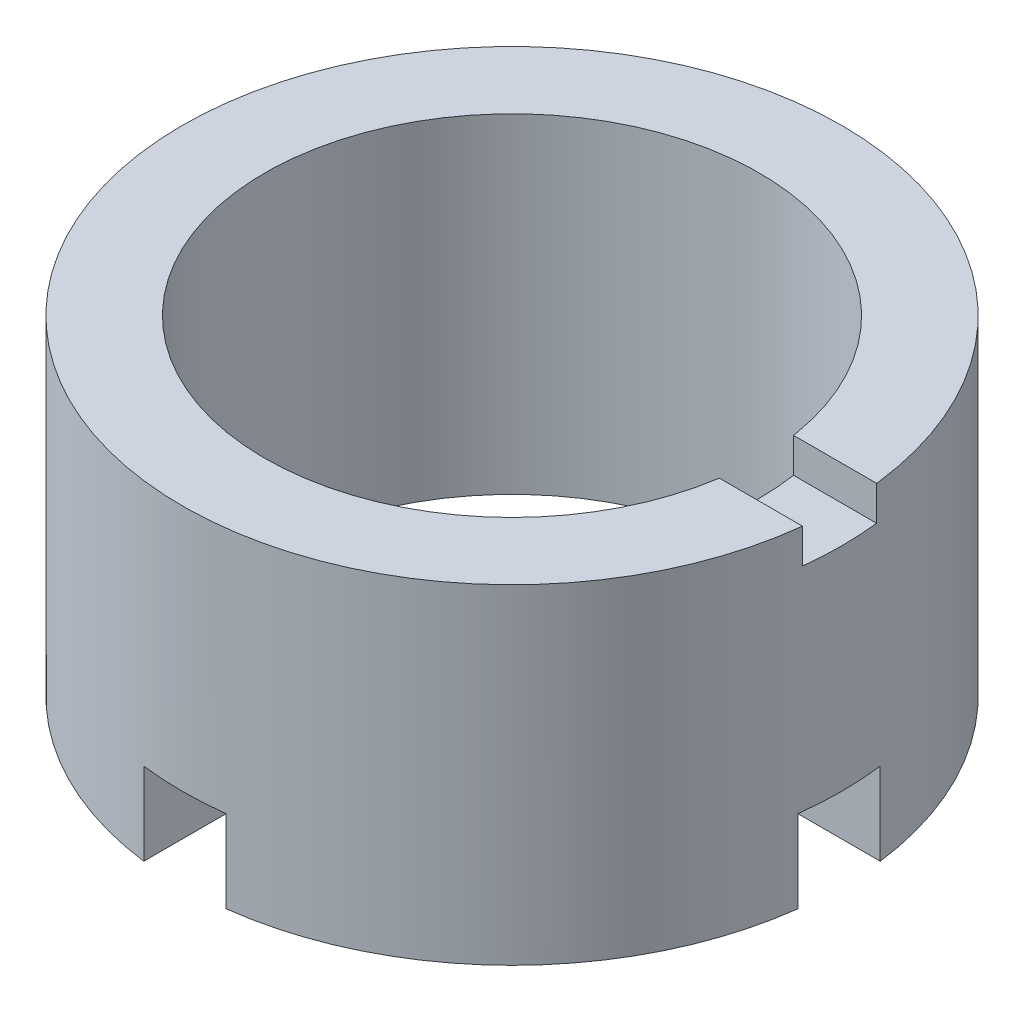
ISO-10303-21;
HEADER;
FILE_DESCRIPTION(('STEP AP214'),'2;1');
FILE_NAME('part.step','',(''),(''),'','','');
FILE_SCHEMA(('AUTOMOTIVE_DESIGN { 1 0 10303 214 1 1 1 1 }'));
ENDSEC;
DATA;
#1=APPLICATION_CONTEXT('core data for automotive mechanical design processes');
#2=APPLICATION_PROTOCOL_DEFINITION('international standard','automotive_design',2000,#1);
#3=PRODUCT_CONTEXT('',#1,'mechanical');
#4=PRODUCT('Part','Part','',(#3));
#5=PRODUCT_RELATED_PRODUCT_CATEGORY('part','',(#4));
#6=PRODUCT_DEFINITION_FORMATION('','',#4);
#7=PRODUCT_DEFINITION_CONTEXT('part definition',#1,'design');
#8=PRODUCT_DEFINITION('design','',#6,#7);
#9=PRODUCT_DEFINITION_SHAPE('','',#8);
#10=(LENGTH_UNIT() NAMED_UNIT(*) SI_UNIT(.MILLI.,.METRE.));
#11=(NAMED_UNIT(*) PLANE_ANGLE_UNIT() SI_UNIT($,.RADIAN.));
#12=(NAMED_UNIT(*) SI_UNIT($,.STERADIAN.) SOLID_ANGLE_UNIT());
#13=UNCERTAINTY_MEASURE_WITH_UNIT(LENGTH_MEASURE(1.E-05),#10,'distance_accuracy_value','');
#14=(GEOMETRIC_REPRESENTATION_CONTEXT(3) GLOBAL_UNCERTAINTY_ASSIGNED_CONTEXT((#13)) GLOBAL_UNIT_ASSIGNED_CONTEXT((#10,
#11,#12)) REPRESENTATION_CONTEXT('',''));
#15=CARTESIAN_POINT('',(0.,0.,0.));
#16=DIRECTION('',(0.,0.,1.));
#17=DIRECTION('',(1.,0.,0.));
#18=AXIS2_PLACEMENT_3D('',#15,#16,#17);
#19=CARTESIAN_POINT('',(0.,0.,0.));
#20=DIRECTION('',(0.,1.,0.));
#21=DIRECTION('',(0.,0.,1.));
#22=AXIS2_PLACEMENT_3D('',#19,#20,#21);
#23=PLANE('',#22);
#24=CARTESIAN_POINT('',(0.,0.,0.));
#25=DIRECTION('',(0.,1.,0.));
#26=DIRECTION('',(0.,0.,1.));
#27=AXIS2_PLACEMENT_3D('',#24,#25,#26);
#28=CIRCLE('',#27,25.4);
#29=CARTESIAN_POINT('',(25.20078123789,0.,-3.17500000000161));
#30=VERTEX_POINT('',#29);
#31=CARTESIAN_POINT('',(-3.17499999999999,0.,25.2007812378902));
#32=VERTEX_POINT('',#31);
#33=EDGE_CURVE('E150',#30,#32,#28,.T.);
#34=ORIENTED_EDGE('',*,*,#33,.F.);
#35=DIRECTION('',(1.,0.,-1.48345037405956E-13));
#36=VECTOR('',#35,1.);
#37=CARTESIAN_POINT('',(33.0200000000024,0.,-3.17500000000277));
#38=LINE('',#37,#36);
#39=CARTESIAN_POINT('',(18.7835533113412,0.,-3.17500000000065));
#40=VERTEX_POINT('',#39);
#41=EDGE_CURVE('E185',#40,#30,#38,.T.);
#42=ORIENTED_EDGE('',*,*,#41,.F.);
#43=CARTESIAN_POINT('',(0.,0.,0.));
#44=DIRECTION('',(0.,1.,0.));
#45=DIRECTION('',(0.,0.,1.));
#46=AXIS2_PLACEMENT_3D('',#43,#44,#45);
#47=CIRCLE('',#46,19.05);
#48=CARTESIAN_POINT('',(-3.17499999999999,0.,18.7835533113413));
#49=VERTEX_POINT('',#48);
#50=EDGE_CURVE('E218',#40,#49,#47,.T.);
#51=ORIENTED_EDGE('',*,*,#50,.T.);
#52=DIRECTION('',(0.,0.,-1.));
#53=VECTOR('',#52,1.);
#54=CARTESIAN_POINT('',(-3.17499999999999,0.,33.02));
#55=LINE('',#54,#53);
#56=EDGE_CURVE('E206',#32,#49,#55,.T.);
#57=ORIENTED_EDGE('',*,*,#56,.F.);
#58=EDGE_LOOP('',(#34,#42,#51,#57));
#59=FACE_BOUND('',#58,.T.);
#60=ADVANCED_FACE('F33',(#59),#23,.F.);
#61=CARTESIAN_POINT('',(0.,25.4,0.));
#62=DIRECTION('',(0.,1.,0.));
#63=DIRECTION('',(0.,0.,1.));
#64=AXIS2_PLACEMENT_3D('',#61,#62,#63);
#65=PLANE('',#64);
#66=DIRECTION('',(1.,0.,0.));
#67=VECTOR('',#66,1.);
#68=CARTESIAN_POINT('',(15.4971331253971,25.4,2.8575));
#69=LINE('',#68,#67);
#70=CARTESIAN_POINT('',(18.8344682364541,25.4,2.8575));
#71=VERTEX_POINT('',#70);
#72=CARTESIAN_POINT('',(25.2387538073891,25.4,2.8575));
#73=VERTEX_POINT('',#72);
#74=EDGE_CURVE('E139',#71,#73,#69,.T.);
#75=ORIENTED_EDGE('',*,*,#74,.F.);
#76=CARTESIAN_POINT('',(0.,25.4,0.));
#77=DIRECTION('',(0.,1.,0.));
#78=DIRECTION('',(0.,0.,1.));
#79=AXIS2_PLACEMENT_3D('',#76,#77,#78);
#80=CIRCLE('',#79,19.05);
#81=CARTESIAN_POINT('',(18.8344682364541,25.4,-2.8575));
#82=VERTEX_POINT('',#81);
#83=EDGE_CURVE('E138',#82,#71,#80,.T.);
#84=ORIENTED_EDGE('',*,*,#83,.F.);
#85=DIRECTION('',(-1.,0.,0.));
#86=VECTOR('',#85,1.);
#87=CARTESIAN_POINT('',(15.4971331253971,25.4,-2.8575));
#88=LINE('',#87,#86);
#89=CARTESIAN_POINT('',(25.2387538073891,25.4,-2.8575));
#90=VERTEX_POINT('',#89);
#91=EDGE_CURVE('E123',#90,#82,#88,.T.);
#92=ORIENTED_EDGE('',*,*,#91,.F.);
#93=CARTESIAN_POINT('',(0.,25.4,0.));
#94=DIRECTION('',(0.,1.,0.));
#95=DIRECTION('',(0.,0.,1.));
#96=AXIS2_PLACEMENT_3D('',#93,#94,#95);
#97=CIRCLE('',#96,25.4);
#98=EDGE_CURVE('E136',#90,#73,#97,.T.);
#99=ORIENTED_EDGE('',*,*,#98,.T.);
#100=EDGE_LOOP('',(#75,#84,#92,#99));
#101=FACE_BOUND('',#100,.T.);
#102=ADVANCED_FACE('F135',(#101),#65,.T.);
#103=CARTESIAN_POINT('',(3.17500000000001,0.,18.7835533113413));
#104=VERTEX_POINT('',#103);
#105=CARTESIAN_POINT('',(18.7835533113414,0.,3.17499999999935));
#106=VERTEX_POINT('',#105);
#107=EDGE_CURVE('E153',#104,#106,#47,.T.);
#108=ORIENTED_EDGE('',*,*,#107,.T.);
#109=DIRECTION('',(-1.,0.,1.4837349415589E-13));
#110=VECTOR('',#109,1.);
#111=CARTESIAN_POINT('',(33.0200000000033,0.,3.17499999999723));
#112=LINE('',#111,#110);
#113=CARTESIAN_POINT('',(25.2007812378904,0.,3.17499999999839));
#114=VERTEX_POINT('',#113);
#115=EDGE_CURVE('E189',#114,#106,#112,.T.);
#116=ORIENTED_EDGE('',*,*,#115,.F.);
#117=CARTESIAN_POINT('',(3.17500000000001,0.,25.2007812378902));
#118=VERTEX_POINT('',#117);
#119=EDGE_CURVE('E144',#118,#114,#28,.T.);
#120=ORIENTED_EDGE('',*,*,#119,.F.);
#121=DIRECTION('',(0.,0.,1.));
#122=VECTOR('',#121,1.);
#123=CARTESIAN_POINT('',(3.17500000000001,0.,33.02));
#124=LINE('',#123,#122);
#125=EDGE_CURVE('E201',#104,#118,#124,.T.);
#126=ORIENTED_EDGE('',*,*,#125,.F.);
#127=EDGE_LOOP('',(#108,#116,#120,#126));
#128=FACE_BOUND('',#127,.T.);
#129=ADVANCED_FACE('F244',(#128),#23,.F.);
#130=CARTESIAN_POINT('',(0.,25.4,0.));
#131=DIRECTION('',(0.,-1.,0.));
#132=DIRECTION('',(0.,0.,-1.));
#133=AXIS2_PLACEMENT_3D('',#130,#131,#132);
#134=CYLINDRICAL_SURFACE('',#133,25.4);
#135=CARTESIAN_POINT('',(0.,22.733,0.));
#136=DIRECTION('',(0.,-1.,0.));
#137=DIRECTION('',(0.,0.,-1.));
#138=AXIS2_PLACEMENT_3D('',#135,#136,#137);
#139=CIRCLE('',#138,25.4);
#140=CARTESIAN_POINT('',(25.2387538073891,22.733,-2.8575));
#141=VERTEX_POINT('',#140);
#142=CARTESIAN_POINT('',(25.2387538073891,22.733,2.8575));
#143=VERTEX_POINT('',#142);
#144=EDGE_CURVE('E129',#141,#143,#139,.T.);
#145=ORIENTED_EDGE('',*,*,#144,.T.);
#146=DIRECTION('',(0.,-1.,0.));
#147=VECTOR('',#146,1.);
#148=CARTESIAN_POINT('',(25.2387538073891,25.4,2.8575));
#149=LINE('',#148,#147);
#150=EDGE_CURVE('E128',#143,#73,#149,.F.);
#151=ORIENTED_EDGE('',*,*,#150,.T.);
#152=ORIENTED_EDGE('',*,*,#98,.F.);
#153=DIRECTION('',(0.,-1.,0.));
#154=VECTOR('',#153,1.);
#155=CARTESIAN_POINT('',(25.2387538073891,25.4,-2.8575));
#156=LINE('',#155,#154);
#157=EDGE_CURVE('E120',#90,#141,#156,.T.);
#158=ORIENTED_EDGE('',*,*,#157,.T.);
#159=EDGE_LOOP('',(#145,#151,#152,#158));
#160=FACE_BOUND('',#159,.T.);
#161=CARTESIAN_POINT('',(0.,6.35,0.));
#162=DIRECTION('',(0.,-1.,0.));
#163=DIRECTION('',(0.,0.,-1.));
#164=AXIS2_PLACEMENT_3D('',#161,#162,#163);
#165=CIRCLE('',#164,25.4);
#166=CARTESIAN_POINT('',(25.20078123789,6.35,-3.17500000000161));
#167=VERTEX_POINT('',#166);
#168=CARTESIAN_POINT('',(25.2007812378904,6.35,3.17499999999839));
#169=VERTEX_POINT('',#168);
#170=EDGE_CURVE('E191',#167,#169,#165,.T.);
#171=ORIENTED_EDGE('',*,*,#170,.F.);
#172=DIRECTION('',(0.,-1.,0.));
#173=VECTOR('',#172,1.);
#174=CARTESIAN_POINT('',(25.20078123789,25.4,-3.17500000000161));
#175=LINE('',#174,#173);
#176=EDGE_CURVE('E198',#167,#30,#175,.T.);
#177=ORIENTED_EDGE('',*,*,#176,.T.);
#178=ORIENTED_EDGE('',*,*,#33,.T.);
#179=DIRECTION('',(0.,-1.,0.));
#180=VECTOR('',#179,1.);
#181=CARTESIAN_POINT('',(-3.17499999999999,25.4,25.2007812378902));
#182=LINE('',#181,#180);
#183=CARTESIAN_POINT('',(-3.17499999999999,6.35,25.2007812378902));
#184=VERTEX_POINT('',#183);
#185=EDGE_CURVE('E213',#32,#184,#182,.F.);
#186=ORIENTED_EDGE('',*,*,#185,.T.);
#187=CARTESIAN_POINT('',(0.,6.35,0.));
#188=DIRECTION('',(0.,-1.,0.));
#189=DIRECTION('',(0.,0.,-1.));
#190=AXIS2_PLACEMENT_3D('',#187,#188,#189);
#191=CIRCLE('',#190,25.4);
#192=CARTESIAN_POINT('',(3.17500000000001,6.35,25.2007812378902));
#193=VERTEX_POINT('',#192);
#194=EDGE_CURVE('E208',#193,#184,#191,.T.);
#195=ORIENTED_EDGE('',*,*,#194,.F.);
#196=DIRECTION('',(0.,-1.,0.));
#197=VECTOR('',#196,1.);
#198=CARTESIAN_POINT('',(3.17500000000001,25.4,25.2007812378902));
#199=LINE('',#198,#197);
#200=EDGE_CURVE('E216',#193,#118,#199,.T.);
#201=ORIENTED_EDGE('',*,*,#200,.T.);
#202=ORIENTED_EDGE('',*,*,#119,.T.);
#203=DIRECTION('',(0.,-1.,0.));
#204=VECTOR('',#203,1.);
#205=CARTESIAN_POINT('',(25.2007812378904,25.4,3.17499999999839));
#206=LINE('',#205,#204);
#207=EDGE_CURVE('E195',#114,#169,#206,.F.);
#208=ORIENTED_EDGE('',*,*,#207,.T.);
#209=EDGE_LOOP('',(#171,#177,#178,#186,#195,#201,#202,#208));
#210=FACE_BOUND('',#209,.T.);
#211=ADVANCED_FACE('F35',(#160,#210),#134,.T.);
#212=CARTESIAN_POINT('',(0.,25.4,0.));
#213=DIRECTION('',(0.,-1.,0.));
#214=DIRECTION('',(0.,0.,-1.));
#215=AXIS2_PLACEMENT_3D('',#212,#213,#214);
#216=CYLINDRICAL_SURFACE('',#215,19.05);
#217=DIRECTION('',(0.,-1.,0.));
#218=VECTOR('',#217,1.);
#219=CARTESIAN_POINT('',(18.8344682364541,25.4,2.8575));
#220=LINE('',#219,#218);
#221=CARTESIAN_POINT('',(18.8344682364541,22.733,2.8575));
#222=VERTEX_POINT('',#221);
#223=EDGE_CURVE('E11',#222,#71,#220,.F.);
#224=ORIENTED_EDGE('',*,*,#223,.F.);
#225=CARTESIAN_POINT('',(0.,22.733,0.));
#226=DIRECTION('',(0.,-1.,0.));
#227=DIRECTION('',(0.,0.,-1.));
#228=AXIS2_PLACEMENT_3D('',#225,#226,#227);
#229=CIRCLE('',#228,19.05);
#230=CARTESIAN_POINT('',(18.8344682364541,22.733,-2.8575));
#231=VERTEX_POINT('',#230);
#232=EDGE_CURVE('E167',#231,#222,#229,.T.);
#233=ORIENTED_EDGE('',*,*,#232,.F.);
#234=DIRECTION('',(0.,-1.,0.));
#235=VECTOR('',#234,1.);
#236=CARTESIAN_POINT('',(18.8344682364541,25.4,-2.8575));
#237=LINE('',#236,#235);
#238=EDGE_CURVE('E41',#82,#231,#237,.T.);
#239=ORIENTED_EDGE('',*,*,#238,.F.);
#240=ORIENTED_EDGE('',*,*,#83,.T.);
#241=EDGE_LOOP('',(#224,#233,#239,#240));
#242=FACE_BOUND('',#241,.T.);
#243=DIRECTION('',(0.,-1.,0.));
#244=VECTOR('',#243,1.);
#245=CARTESIAN_POINT('',(18.7835533113412,25.4,-3.17500000000065));
#246=LINE('',#245,#244);
#247=CARTESIAN_POINT('',(18.7835533113412,6.35,-3.17500000000065));
#248=VERTEX_POINT('',#247);
#249=EDGE_CURVE('E165',#248,#40,#246,.T.);
#250=ORIENTED_EDGE('',*,*,#249,.F.);
#251=CARTESIAN_POINT('',(0.,6.35,0.));
#252=DIRECTION('',(0.,-1.,0.));
#253=DIRECTION('',(0.,0.,-1.));
#254=AXIS2_PLACEMENT_3D('',#251,#252,#253);
#255=CIRCLE('',#254,19.05);
#256=CARTESIAN_POINT('',(18.7835533113414,6.35,3.17499999999935));
#257=VERTEX_POINT('',#256);
#258=EDGE_CURVE('E160',#248,#257,#255,.T.);
#259=ORIENTED_EDGE('',*,*,#258,.T.);
#260=DIRECTION('',(0.,-1.,0.));
#261=VECTOR('',#260,1.);
#262=CARTESIAN_POINT('',(18.7835533113414,25.4,3.17499999999935));
#263=LINE('',#262,#261);
#264=EDGE_CURVE('E163',#106,#257,#263,.F.);
#265=ORIENTED_EDGE('',*,*,#264,.F.);
#266=ORIENTED_EDGE('',*,*,#107,.F.);
#267=DIRECTION('',(0.,-1.,0.));
#268=VECTOR('',#267,1.);
#269=CARTESIAN_POINT('',(3.17500000000001,25.4,18.7835533113413));
#270=LINE('',#269,#268);
#271=CARTESIAN_POINT('',(3.17500000000001,6.35,18.7835533113413));
#272=VERTEX_POINT('',#271);
#273=EDGE_CURVE('E158',#272,#104,#270,.T.);
#274=ORIENTED_EDGE('',*,*,#273,.F.);
#275=CARTESIAN_POINT('',(0.,6.35,0.));
#276=DIRECTION('',(0.,-1.,0.));
#277=DIRECTION('',(0.,0.,-1.));
#278=AXIS2_PLACEMENT_3D('',#275,#276,#277);
#279=CIRCLE('',#278,19.05);
#280=CARTESIAN_POINT('',(-3.17499999999999,6.35,18.7835533113413));
#281=VERTEX_POINT('',#280);
#282=EDGE_CURVE('E143',#272,#281,#279,.T.);
#283=ORIENTED_EDGE('',*,*,#282,.T.);
#284=DIRECTION('',(0.,-1.,0.));
#285=VECTOR('',#284,1.);
#286=CARTESIAN_POINT('',(-3.17499999999999,25.4,18.7835533113413));
#287=LINE('',#286,#285);
#288=EDGE_CURVE('E147',#49,#281,#287,.F.);
#289=ORIENTED_EDGE('',*,*,#288,.F.);
#290=ORIENTED_EDGE('',*,*,#50,.F.);
#291=EDGE_LOOP('',(#250,#259,#265,#266,#274,#283,#289,#290));
#292=FACE_BOUND('',#291,.T.);
#293=ADVANCED_FACE('F171',(#242,#292),#216,.F.);
#294=CARTESIAN_POINT('',(3.17500000000001,6.35,33.02));
#295=DIRECTION('',(1.,0.,0.));
#296=DIRECTION('',(0.,0.,-1.));
#297=AXIS2_PLACEMENT_3D('',#294,#295,#296);
#298=PLANE('',#297);
#299=DIRECTION('',(0.,0.,1.));
#300=VECTOR('',#299,1.);
#301=CARTESIAN_POINT('',(3.17500000000001,6.35,33.02));
#302=LINE('',#301,#300);
#303=EDGE_CURVE('E202',#272,#193,#302,.T.);
#304=ORIENTED_EDGE('',*,*,#303,.F.);
#305=ORIENTED_EDGE('',*,*,#273,.T.);
#306=ORIENTED_EDGE('',*,*,#125,.T.);
#307=ORIENTED_EDGE('',*,*,#200,.F.);
#308=EDGE_LOOP('',(#304,#305,#306,#307));
#309=FACE_BOUND('',#308,.T.);
#310=ADVANCED_FACE('F241',(#309),#298,.F.);
#311=CARTESIAN_POINT('',(-3.17499999999999,6.35,33.02));
#312=DIRECTION('',(-1.,0.,0.));
#313=DIRECTION('',(0.,0.,1.));
#314=AXIS2_PLACEMENT_3D('',#311,#312,#313);
#315=PLANE('',#314);
#316=ORIENTED_EDGE('',*,*,#56,.T.);
#317=ORIENTED_EDGE('',*,*,#288,.T.);
#318=DIRECTION('',(0.,0.,-1.));
#319=VECTOR('',#318,1.);
#320=CARTESIAN_POINT('',(-3.17499999999999,6.35,33.02));
#321=LINE('',#320,#319);
#322=EDGE_CURVE('E205',#184,#281,#321,.T.);
#323=ORIENTED_EDGE('',*,*,#322,.F.);
#324=ORIENTED_EDGE('',*,*,#185,.F.);
#325=EDGE_LOOP('',(#316,#317,#323,#324));
#326=FACE_BOUND('',#325,.T.);
#327=ADVANCED_FACE('F233',(#326),#315,.F.);
#328=CARTESIAN_POINT('',(0.,6.35,0.));
#329=DIRECTION('',(0.,-1.,0.));
#330=DIRECTION('',(0.,0.,-1.));
#331=AXIS2_PLACEMENT_3D('',#328,#329,#330);
#332=PLANE('',#331);
#333=ORIENTED_EDGE('',*,*,#194,.T.);
#334=ORIENTED_EDGE('',*,*,#322,.T.);
#335=ORIENTED_EDGE('',*,*,#282,.F.);
#336=ORIENTED_EDGE('',*,*,#303,.T.);
#337=EDGE_LOOP('',(#333,#334,#335,#336));
#338=FACE_BOUND('',#337,.T.);
#339=ADVANCED_FACE('F238',(#338),#332,.T.);
#340=CARTESIAN_POINT('',(33.0200000000024,6.35,-3.17500000000277));
#341=DIRECTION('',(-1.48345037405956E-13,0.,-1.));
#342=DIRECTION('',(-1.,0.,1.48345037405956E-13));
#343=AXIS2_PLACEMENT_3D('',#340,#341,#342);
#344=PLANE('',#343);
#345=DIRECTION('',(1.,0.,-1.48345037405956E-13));
#346=VECTOR('',#345,1.);
#347=CARTESIAN_POINT('',(33.0200000000024,6.35,-3.17500000000277));
#348=LINE('',#347,#346);
#349=EDGE_CURVE('E186',#248,#167,#348,.T.);
#350=ORIENTED_EDGE('',*,*,#349,.F.);
#351=ORIENTED_EDGE('',*,*,#249,.T.);
#352=ORIENTED_EDGE('',*,*,#41,.T.);
#353=ORIENTED_EDGE('',*,*,#176,.F.);
#354=EDGE_LOOP('',(#350,#351,#352,#353));
#355=FACE_BOUND('',#354,.T.);
#356=ADVANCED_FACE('F251',(#355),#344,.F.);
#357=CARTESIAN_POINT('',(33.0200000000033,6.35,3.17499999999723));
#358=DIRECTION('',(1.4837349415589E-13,0.,1.));
#359=DIRECTION('',(1.,0.,-1.4837349415589E-13));
#360=AXIS2_PLACEMENT_3D('',#357,#358,#359);
#361=PLANE('',#360);
#362=ORIENTED_EDGE('',*,*,#115,.T.);
#363=ORIENTED_EDGE('',*,*,#264,.T.);
#364=DIRECTION('',(-1.,0.,1.4837349415589E-13));
#365=VECTOR('',#364,1.);
#366=CARTESIAN_POINT('',(33.0200000000033,6.35,3.17499999999723));
#367=LINE('',#366,#365);
#368=EDGE_CURVE('E56',#169,#257,#367,.T.);
#369=ORIENTED_EDGE('',*,*,#368,.F.);
#370=ORIENTED_EDGE('',*,*,#207,.F.);
#371=EDGE_LOOP('',(#362,#363,#369,#370));
#372=FACE_BOUND('',#371,.T.);
#373=ADVANCED_FACE('F247',(#372),#361,.F.);
#374=CARTESIAN_POINT('',(0.,6.35,0.));
#375=DIRECTION('',(0.,-1.,0.));
#376=DIRECTION('',(0.,0.,-1.));
#377=AXIS2_PLACEMENT_3D('',#374,#375,#376);
#378=PLANE('',#377);
#379=ORIENTED_EDGE('',*,*,#170,.T.);
#380=ORIENTED_EDGE('',*,*,#368,.T.);
#381=ORIENTED_EDGE('',*,*,#258,.F.);
#382=ORIENTED_EDGE('',*,*,#349,.T.);
#383=EDGE_LOOP('',(#379,#380,#381,#382));
#384=FACE_BOUND('',#383,.T.);
#385=ADVANCED_FACE('F249',(#384),#378,.T.);
#386=CARTESIAN_POINT('',(15.4971331253971,22.733,2.8575));
#387=DIRECTION('',(0.,0.,1.));
#388=DIRECTION('',(1.,0.,0.));
#389=AXIS2_PLACEMENT_3D('',#386,#387,#388);
#390=PLANE('',#389);
#391=DIRECTION('',(1.,0.,0.));
#392=VECTOR('',#391,1.);
#393=CARTESIAN_POINT('',(15.4971331253971,22.733,2.8575));
#394=LINE('',#393,#392);
#395=EDGE_CURVE('E176',#222,#143,#394,.T.);
#396=ORIENTED_EDGE('',*,*,#395,.F.);
#397=ORIENTED_EDGE('',*,*,#223,.T.);
#398=ORIENTED_EDGE('',*,*,#74,.T.);
#399=ORIENTED_EDGE('',*,*,#150,.F.);
#400=EDGE_LOOP('',(#396,#397,#398,#399));
#401=FACE_BOUND('',#400,.T.);
#402=ADVANCED_FACE('F178',(#401),#390,.F.);
#403=CARTESIAN_POINT('',(15.4971331253971,22.733,-2.8575));
#404=DIRECTION('',(0.,0.,-1.));
#405=DIRECTION('',(-1.,0.,0.));
#406=AXIS2_PLACEMENT_3D('',#403,#404,#405);
#407=PLANE('',#406);
#408=ORIENTED_EDGE('',*,*,#91,.T.);
#409=ORIENTED_EDGE('',*,*,#238,.T.);
#410=DIRECTION('',(-1.,0.,0.));
#411=VECTOR('',#410,1.);
#412=CARTESIAN_POINT('',(15.4971331253971,22.733,-2.8575));
#413=LINE('',#412,#411);
#414=EDGE_CURVE('E48',#141,#231,#413,.T.);
#415=ORIENTED_EDGE('',*,*,#414,.F.);
#416=ORIENTED_EDGE('',*,*,#157,.F.);
#417=EDGE_LOOP('',(#408,#409,#415,#416));
#418=FACE_BOUND('',#417,.T.);
#419=ADVANCED_FACE('F122',(#418),#407,.F.);
#420=CARTESIAN_POINT('',(0.,22.733,0.));
#421=DIRECTION('',(0.,-1.,0.));
#422=DIRECTION('',(0.,0.,-1.));
#423=AXIS2_PLACEMENT_3D('',#420,#421,#422);
#424=PLANE('',#423);
#425=ORIENTED_EDGE('',*,*,#414,.T.);
#426=ORIENTED_EDGE('',*,*,#232,.T.);
#427=ORIENTED_EDGE('',*,*,#395,.T.);
#428=ORIENTED_EDGE('',*,*,#144,.F.);
#429=EDGE_LOOP('',(#425,#426,#427,#428));
#430=FACE_BOUND('',#429,.T.);
#431=ADVANCED_FACE('F175',(#430),#424,.F.);
#432=CLOSED_SHELL('',(#60,#102,#129,#211,#293,#310,#327,#339,#356,#373,#385,#402,#419,#431));
#433=MANIFOLD_SOLID_BREP('B2',#432);
#434=ADVANCED_BREP_SHAPE_REPRESENTATION('',(#18,#433),#14);
#435=SHAPE_DEFINITION_REPRESENTATION(#9,#434);
ENDSEC;
END-ISO-10303-21;
